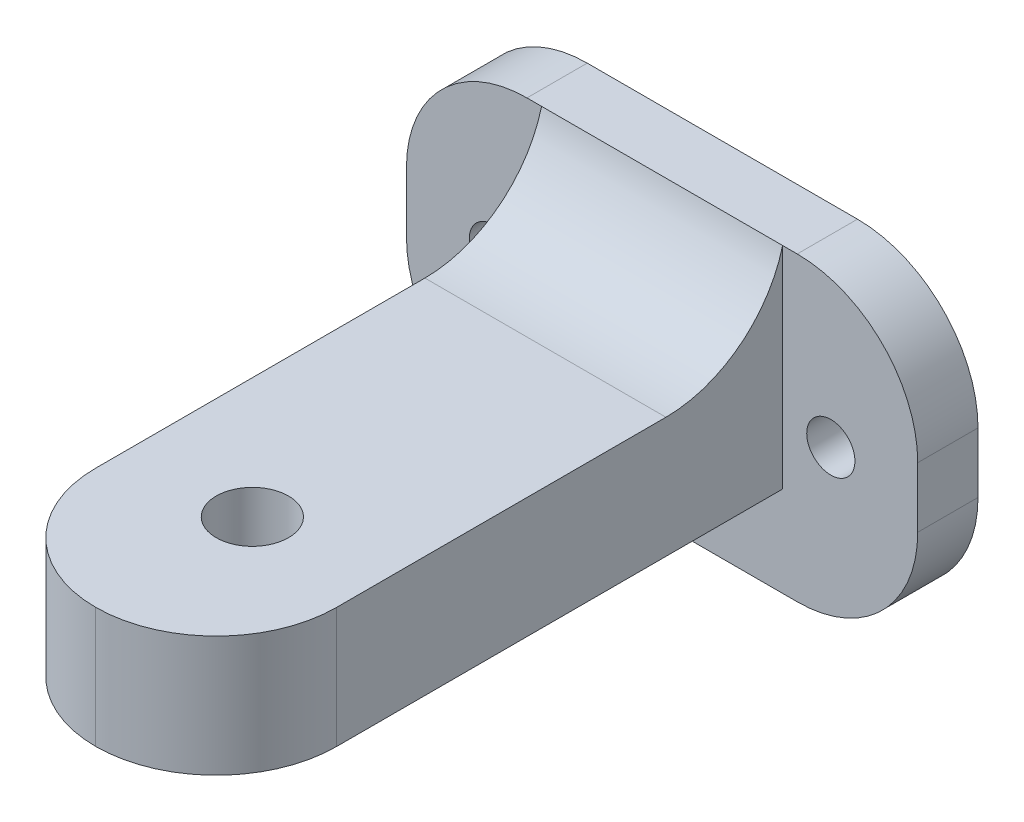
ISO-10303-21;
HEADER;
FILE_DESCRIPTION(('STEP AP214'),'2;1');
FILE_NAME('part.step','',(''),(''),'','','');
FILE_SCHEMA(('AUTOMOTIVE_DESIGN { 1 0 10303 214 1 1 1 1 }'));
ENDSEC;
DATA;
#1=APPLICATION_CONTEXT('core data for automotive mechanical design processes');
#2=APPLICATION_PROTOCOL_DEFINITION('international standard','automotive_design',2000,#1);
#3=PRODUCT_CONTEXT('',#1,'mechanical');
#4=PRODUCT('Part','Part','',(#3));
#5=PRODUCT_RELATED_PRODUCT_CATEGORY('part','',(#4));
#6=PRODUCT_DEFINITION_FORMATION('','',#4);
#7=PRODUCT_DEFINITION_CONTEXT('part definition',#1,'design');
#8=PRODUCT_DEFINITION('design','',#6,#7);
#9=PRODUCT_DEFINITION_SHAPE('','',#8);
#10=(LENGTH_UNIT() NAMED_UNIT(*) SI_UNIT(.MILLI.,.METRE.));
#11=(NAMED_UNIT(*) PLANE_ANGLE_UNIT() SI_UNIT($,.RADIAN.));
#12=(NAMED_UNIT(*) SI_UNIT($,.STERADIAN.) SOLID_ANGLE_UNIT());
#13=UNCERTAINTY_MEASURE_WITH_UNIT(LENGTH_MEASURE(1.E-05),#10,'distance_accuracy_value','');
#14=(GEOMETRIC_REPRESENTATION_CONTEXT(3) GLOBAL_UNCERTAINTY_ASSIGNED_CONTEXT((#13)) GLOBAL_UNIT_ASSIGNED_CONTEXT((#10,
#11,#12)) REPRESENTATION_CONTEXT('',''));
#15=CARTESIAN_POINT('',(0.,0.,0.));
#16=DIRECTION('',(0.,0.,1.));
#17=DIRECTION('',(1.,0.,0.));
#18=AXIS2_PLACEMENT_3D('',#15,#16,#17);
#19=CARTESIAN_POINT('',(0.,0.,5.));
#20=DIRECTION('',(0.,0.,1.));
#21=DIRECTION('',(1.,0.,0.));
#22=AXIS2_PLACEMENT_3D('',#19,#20,#21);
#23=PLANE('',#22);
#24=CARTESIAN_POINT('',(-14.,0.,5.));
#25=DIRECTION('',(0.,0.,1.));
#26=DIRECTION('',(1.,0.,0.));
#27=AXIS2_PLACEMENT_3D('',#24,#25,#26);
#28=CIRCLE('',#27,2.);
#29=CARTESIAN_POINT('',(-12.,0.,5.));
#30=VERTEX_POINT('',#29);
#31=EDGE_CURVE('E179',#30,#30,#28,.T.);
#32=ORIENTED_EDGE('',*,*,#31,.F.);
#33=EDGE_LOOP('',(#32));
#34=FACE_BOUND('',#33,.T.);
#35=DIRECTION('',(0.,-1.,0.));
#36=VECTOR('',#35,1.);
#37=CARTESIAN_POINT('',(-9.99999999999999,-5.,5.));
#38=LINE('',#37,#36);
#39=CARTESIAN_POINT('',(-9.99999999999999,12.5,5.));
#40=VERTEX_POINT('',#39);
#41=CARTESIAN_POINT('',(-9.99999999999999,-5.,5.));
#42=VERTEX_POINT('',#41);
#43=EDGE_CURVE('E153',#40,#42,#38,.T.);
#44=ORIENTED_EDGE('',*,*,#43,.F.);
#45=DIRECTION('',(-1.,0.,0.));
#46=VECTOR('',#45,1.);
#47=CARTESIAN_POINT('',(21.2127953618266,12.5,5.));
#48=LINE('',#47,#46);
#49=CARTESIAN_POINT('',(-11.2127953618266,12.5,5.));
#50=VERTEX_POINT('',#49);
#51=EDGE_CURVE('E195',#40,#50,#48,.T.);
#52=ORIENTED_EDGE('',*,*,#51,.T.);
#53=CARTESIAN_POINT('',(-11.2127953618266,2.5,5.));
#54=DIRECTION('',(0.,0.,1.));
#55=DIRECTION('',(1.,0.,0.));
#56=AXIS2_PLACEMENT_3D('',#53,#54,#55);
#57=CIRCLE('',#56,10.);
#58=CARTESIAN_POINT('',(-21.2127953618266,2.5,5.));
#59=VERTEX_POINT('',#58);
#60=EDGE_CURVE('E227',#50,#59,#57,.T.);
#61=ORIENTED_EDGE('',*,*,#60,.T.);
#62=DIRECTION('',(0.,-1.,0.));
#63=VECTOR('',#62,1.);
#64=CARTESIAN_POINT('',(-21.2127953618266,-12.5,5.));
#65=LINE('',#64,#63);
#66=CARTESIAN_POINT('',(-21.2127953618266,-2.5,5.));
#67=VERTEX_POINT('',#66);
#68=EDGE_CURVE('E185',#59,#67,#65,.T.);
#69=ORIENTED_EDGE('',*,*,#68,.T.);
#70=CARTESIAN_POINT('',(-11.2127953618266,-2.5,5.));
#71=DIRECTION('',(0.,0.,1.));
#72=DIRECTION('',(1.,0.,0.));
#73=AXIS2_PLACEMENT_3D('',#70,#71,#72);
#74=CIRCLE('',#73,10.);
#75=CARTESIAN_POINT('',(-11.2127953618266,-12.5,5.));
#76=VERTEX_POINT('',#75);
#77=EDGE_CURVE('E233',#67,#76,#74,.T.);
#78=ORIENTED_EDGE('',*,*,#77,.T.);
#79=DIRECTION('',(1.,0.,0.));
#80=VECTOR('',#79,1.);
#81=CARTESIAN_POINT('',(21.2127953618266,-12.5,5.));
#82=LINE('',#81,#80);
#83=CARTESIAN_POINT('',(11.2127953618266,-12.5,5.));
#84=VERTEX_POINT('',#83);
#85=EDGE_CURVE('E188',#76,#84,#82,.T.);
#86=ORIENTED_EDGE('',*,*,#85,.T.);
#87=CARTESIAN_POINT('',(11.2127953618266,-2.5,5.));
#88=DIRECTION('',(0.,0.,1.));
#89=DIRECTION('',(1.,0.,0.));
#90=AXIS2_PLACEMENT_3D('',#87,#88,#89);
#91=CIRCLE('',#90,10.);
#92=CARTESIAN_POINT('',(21.2127953618266,-2.5,5.));
#93=VERTEX_POINT('',#92);
#94=EDGE_CURVE('E231',#84,#93,#91,.T.);
#95=ORIENTED_EDGE('',*,*,#94,.T.);
#96=DIRECTION('',(0.,1.,0.));
#97=VECTOR('',#96,1.);
#98=CARTESIAN_POINT('',(21.2127953618266,-12.5,5.));
#99=LINE('',#98,#97);
#100=CARTESIAN_POINT('',(21.2127953618266,2.5,5.));
#101=VERTEX_POINT('',#100);
#102=EDGE_CURVE('E192',#93,#101,#99,.T.);
#103=ORIENTED_EDGE('',*,*,#102,.T.);
#104=CARTESIAN_POINT('',(11.2127953618266,2.5,5.));
#105=DIRECTION('',(0.,0.,1.));
#106=DIRECTION('',(1.,0.,0.));
#107=AXIS2_PLACEMENT_3D('',#104,#105,#106);
#108=CIRCLE('',#107,10.);
#109=CARTESIAN_POINT('',(11.2127953618266,12.5,5.));
#110=VERTEX_POINT('',#109);
#111=EDGE_CURVE('E229',#101,#110,#108,.T.);
#112=ORIENTED_EDGE('',*,*,#111,.T.);
#113=CARTESIAN_POINT('',(10.,12.5,5.));
#114=VERTEX_POINT('',#113);
#115=EDGE_CURVE('E196',#110,#114,#48,.T.);
#116=ORIENTED_EDGE('',*,*,#115,.T.);
#117=DIRECTION('',(0.,1.,0.));
#118=VECTOR('',#117,1.);
#119=CARTESIAN_POINT('',(10.,-5.,5.));
#120=LINE('',#119,#118);
#121=CARTESIAN_POINT('',(10.,-5.,5.));
#122=VERTEX_POINT('',#121);
#123=EDGE_CURVE('E162',#122,#114,#120,.T.);
#124=ORIENTED_EDGE('',*,*,#123,.F.);
#125=DIRECTION('',(1.,0.,0.));
#126=VECTOR('',#125,1.);
#127=CARTESIAN_POINT('',(10.,-5.,5.));
#128=LINE('',#127,#126);
#129=EDGE_CURVE('E144',#42,#122,#128,.T.);
#130=ORIENTED_EDGE('',*,*,#129,.F.);
#131=EDGE_LOOP('',(#44,#52,#61,#69,#78,#86,#95,#103,#112,#116,#124,#130));
#132=FACE_BOUND('',#131,.T.);
#133=CARTESIAN_POINT('',(14.,0.,5.));
#134=DIRECTION('',(0.,0.,1.));
#135=DIRECTION('',(-1.,0.,0.));
#136=AXIS2_PLACEMENT_3D('',#133,#134,#135);
#137=CIRCLE('',#136,2.);
#138=CARTESIAN_POINT('',(12.,0.,5.));
#139=VERTEX_POINT('',#138);
#140=EDGE_CURVE('E173',#139,#139,#137,.T.);
#141=ORIENTED_EDGE('',*,*,#140,.F.);
#142=EDGE_LOOP('',(#141));
#143=FACE_BOUND('',#142,.T.);
#144=ADVANCED_FACE('F41',(#34,#132,#143),#23,.T.);
#145=CARTESIAN_POINT('',(0.,0.,0.));
#146=DIRECTION('',(0.,0.,1.));
#147=DIRECTION('',(1.,0.,0.));
#148=AXIS2_PLACEMENT_3D('',#145,#146,#147);
#149=PLANE('',#148);
#150=DIRECTION('',(1.,0.,0.));
#151=VECTOR('',#150,1.);
#152=CARTESIAN_POINT('',(21.2127953618266,-12.5,0.));
#153=LINE('',#152,#151);
#154=CARTESIAN_POINT('',(-11.2127953618266,-12.5,0.));
#155=VERTEX_POINT('',#154);
#156=CARTESIAN_POINT('',(11.2127953618266,-12.5,0.));
#157=VERTEX_POINT('',#156);
#158=EDGE_CURVE('E202',#155,#157,#153,.T.);
#159=ORIENTED_EDGE('',*,*,#158,.F.);
#160=CARTESIAN_POINT('',(-11.2127953618266,-2.5,0.));
#161=DIRECTION('',(0.,0.,1.));
#162=DIRECTION('',(1.,0.,0.));
#163=AXIS2_PLACEMENT_3D('',#160,#161,#162);
#164=CIRCLE('',#163,10.);
#165=CARTESIAN_POINT('',(-21.2127953618266,-2.5,0.));
#166=VERTEX_POINT('',#165);
#167=EDGE_CURVE('E220',#155,#166,#164,.F.);
#168=ORIENTED_EDGE('',*,*,#167,.T.);
#169=DIRECTION('',(0.,-1.,0.));
#170=VECTOR('',#169,1.);
#171=CARTESIAN_POINT('',(-21.2127953618266,-12.5,0.));
#172=LINE('',#171,#170);
#173=CARTESIAN_POINT('',(-21.2127953618266,2.5,0.));
#174=VERTEX_POINT('',#173);
#175=EDGE_CURVE('E182',#174,#166,#172,.T.);
#176=ORIENTED_EDGE('',*,*,#175,.F.);
#177=CARTESIAN_POINT('',(-11.2127953618266,2.5,0.));
#178=DIRECTION('',(0.,0.,1.));
#179=DIRECTION('',(1.,0.,0.));
#180=AXIS2_PLACEMENT_3D('',#177,#178,#179);
#181=CIRCLE('',#180,10.);
#182=CARTESIAN_POINT('',(-11.2127953618266,12.5,0.));
#183=VERTEX_POINT('',#182);
#184=EDGE_CURVE('E214',#174,#183,#181,.F.);
#185=ORIENTED_EDGE('',*,*,#184,.T.);
#186=DIRECTION('',(-1.,0.,0.));
#187=VECTOR('',#186,1.);
#188=CARTESIAN_POINT('',(21.2127953618266,12.5,0.));
#189=LINE('',#188,#187);
#190=CARTESIAN_POINT('',(11.2127953618266,12.5,0.));
#191=VERTEX_POINT('',#190);
#192=EDGE_CURVE('E189',#191,#183,#189,.T.);
#193=ORIENTED_EDGE('',*,*,#192,.F.);
#194=CARTESIAN_POINT('',(11.2127953618266,2.5,0.));
#195=DIRECTION('',(0.,0.,1.));
#196=DIRECTION('',(1.,0.,0.));
#197=AXIS2_PLACEMENT_3D('',#194,#195,#196);
#198=CIRCLE('',#197,10.);
#199=CARTESIAN_POINT('',(21.2127953618266,2.5,0.));
#200=VERTEX_POINT('',#199);
#201=EDGE_CURVE('E216',#191,#200,#198,.F.);
#202=ORIENTED_EDGE('',*,*,#201,.T.);
#203=DIRECTION('',(0.,1.,0.));
#204=VECTOR('',#203,1.);
#205=CARTESIAN_POINT('',(21.2127953618266,-12.5,0.));
#206=LINE('',#205,#204);
#207=CARTESIAN_POINT('',(21.2127953618266,-2.5,0.));
#208=VERTEX_POINT('',#207);
#209=EDGE_CURVE('E205',#208,#200,#206,.T.);
#210=ORIENTED_EDGE('',*,*,#209,.F.);
#211=CARTESIAN_POINT('',(11.2127953618266,-2.5,0.));
#212=DIRECTION('',(0.,0.,1.));
#213=DIRECTION('',(1.,0.,0.));
#214=AXIS2_PLACEMENT_3D('',#211,#212,#213);
#215=CIRCLE('',#214,10.);
#216=EDGE_CURVE('E218',#208,#157,#215,.F.);
#217=ORIENTED_EDGE('',*,*,#216,.T.);
#218=EDGE_LOOP('',(#159,#168,#176,#185,#193,#202,#210,#217));
#219=FACE_BOUND('',#218,.T.);
#220=CARTESIAN_POINT('',(-14.,0.,0.));
#221=DIRECTION('',(0.,0.,1.));
#222=DIRECTION('',(1.,0.,0.));
#223=AXIS2_PLACEMENT_3D('',#220,#221,#222);
#224=CIRCLE('',#223,2.);
#225=CARTESIAN_POINT('',(-12.,0.,0.));
#226=VERTEX_POINT('',#225);
#227=EDGE_CURVE('E176',#226,#226,#224,.T.);
#228=ORIENTED_EDGE('',*,*,#227,.T.);
#229=EDGE_LOOP('',(#228));
#230=FACE_BOUND('',#229,.T.);
#231=CARTESIAN_POINT('',(14.,0.,0.));
#232=DIRECTION('',(0.,0.,1.));
#233=DIRECTION('',(-1.,0.,0.));
#234=AXIS2_PLACEMENT_3D('',#231,#232,#233);
#235=CIRCLE('',#234,2.);
#236=CARTESIAN_POINT('',(12.,0.,0.));
#237=VERTEX_POINT('',#236);
#238=EDGE_CURVE('E149',#237,#237,#235,.T.);
#239=ORIENTED_EDGE('',*,*,#238,.T.);
#240=EDGE_LOOP('',(#239));
#241=FACE_BOUND('',#240,.T.);
#242=ADVANCED_FACE('F294',(#219,#230,#241),#149,.F.);
#243=CARTESIAN_POINT('',(-21.2127953618266,-12.5,5.));
#244=DIRECTION('',(1.,0.,0.));
#245=DIRECTION('',(0.,0.,-1.));
#246=AXIS2_PLACEMENT_3D('',#243,#244,#245);
#247=PLANE('',#246);
#248=ORIENTED_EDGE('',*,*,#175,.T.);
#249=DIRECTION('',(0.,0.,-1.));
#250=VECTOR('',#249,1.);
#251=CARTESIAN_POINT('',(-21.2127953618266,-2.5,5.));
#252=LINE('',#251,#250);
#253=EDGE_CURVE('E225',#166,#67,#252,.F.);
#254=ORIENTED_EDGE('',*,*,#253,.T.);
#255=ORIENTED_EDGE('',*,*,#68,.F.);
#256=DIRECTION('',(0.,0.,-1.));
#257=VECTOR('',#256,1.);
#258=CARTESIAN_POINT('',(-21.2127953618266,2.5,5.));
#259=LINE('',#258,#257);
#260=EDGE_CURVE('E222',#59,#174,#259,.T.);
#261=ORIENTED_EDGE('',*,*,#260,.T.);
#262=EDGE_LOOP('',(#248,#254,#255,#261));
#263=FACE_BOUND('',#262,.T.);
#264=ADVANCED_FACE('F290',(#263),#247,.F.);
#265=CARTESIAN_POINT('',(21.2127953618266,-12.5,5.));
#266=DIRECTION('',(0.,1.,0.));
#267=DIRECTION('',(-1.,0.,0.));
#268=AXIS2_PLACEMENT_3D('',#265,#266,#267);
#269=PLANE('',#268);
#270=ORIENTED_EDGE('',*,*,#85,.F.);
#271=DIRECTION('',(0.,0.,-1.));
#272=VECTOR('',#271,1.);
#273=CARTESIAN_POINT('',(-11.2127953618266,-12.5,5.));
#274=LINE('',#273,#272);
#275=EDGE_CURVE('E211',#76,#155,#274,.T.);
#276=ORIENTED_EDGE('',*,*,#275,.T.);
#277=ORIENTED_EDGE('',*,*,#158,.T.);
#278=DIRECTION('',(0.,0.,-1.));
#279=VECTOR('',#278,1.);
#280=CARTESIAN_POINT('',(11.2127953618266,-12.5,5.));
#281=LINE('',#280,#279);
#282=EDGE_CURVE('E198',#157,#84,#281,.F.);
#283=ORIENTED_EDGE('',*,*,#282,.T.);
#284=EDGE_LOOP('',(#270,#276,#277,#283));
#285=FACE_BOUND('',#284,.T.);
#286=ADVANCED_FACE('F302',(#285),#269,.F.);
#287=CARTESIAN_POINT('',(21.2127953618266,-12.5,5.));
#288=DIRECTION('',(-1.,0.,0.));
#289=DIRECTION('',(0.,0.,1.));
#290=AXIS2_PLACEMENT_3D('',#287,#288,#289);
#291=PLANE('',#290);
#292=ORIENTED_EDGE('',*,*,#102,.F.);
#293=DIRECTION('',(0.,0.,-1.));
#294=VECTOR('',#293,1.);
#295=CARTESIAN_POINT('',(21.2127953618266,-2.5,5.));
#296=LINE('',#295,#294);
#297=EDGE_CURVE('E237',#93,#208,#296,.T.);
#298=ORIENTED_EDGE('',*,*,#297,.T.);
#299=ORIENTED_EDGE('',*,*,#209,.T.);
#300=DIRECTION('',(0.,0.,-1.));
#301=VECTOR('',#300,1.);
#302=CARTESIAN_POINT('',(21.2127953618266,2.5,5.));
#303=LINE('',#302,#301);
#304=EDGE_CURVE('E235',#200,#101,#303,.F.);
#305=ORIENTED_EDGE('',*,*,#304,.T.);
#306=EDGE_LOOP('',(#292,#298,#299,#305));
#307=FACE_BOUND('',#306,.T.);
#308=ADVANCED_FACE('F311',(#307),#291,.F.);
#309=CARTESIAN_POINT('',(21.2127953618266,12.5,5.));
#310=DIRECTION('',(0.,-1.,0.));
#311=DIRECTION('',(1.,0.,0.));
#312=AXIS2_PLACEMENT_3D('',#309,#310,#311);
#313=PLANE('',#312);
#314=ORIENTED_EDGE('',*,*,#115,.F.);
#315=DIRECTION('',(0.,0.,-1.));
#316=VECTOR('',#315,1.);
#317=CARTESIAN_POINT('',(11.2127953618266,12.5,5.));
#318=LINE('',#317,#316);
#319=EDGE_CURVE('E243',#110,#191,#318,.T.);
#320=ORIENTED_EDGE('',*,*,#319,.T.);
#321=ORIENTED_EDGE('',*,*,#192,.T.);
#322=DIRECTION('',(0.,0.,-1.));
#323=VECTOR('',#322,1.);
#324=CARTESIAN_POINT('',(-11.2127953618266,12.5,5.));
#325=LINE('',#324,#323);
#326=EDGE_CURVE('E240',#183,#50,#325,.F.);
#327=ORIENTED_EDGE('',*,*,#326,.T.);
#328=ORIENTED_EDGE('',*,*,#51,.F.);
#329=EDGE_CURVE('E199',#114,#40,#48,.T.);
#330=ORIENTED_EDGE('',*,*,#329,.F.);
#331=EDGE_LOOP('',(#314,#320,#321,#327,#328,#330));
#332=FACE_BOUND('',#331,.T.);
#333=ADVANCED_FACE('F283',(#332),#313,.F.);
#334=CARTESIAN_POINT('',(-14.,0.,5.));
#335=DIRECTION('',(0.,0.,-1.));
#336=DIRECTION('',(-1.,0.,0.));
#337=AXIS2_PLACEMENT_3D('',#334,#335,#336);
#338=CYLINDRICAL_SURFACE('',#337,2.);
#339=ORIENTED_EDGE('',*,*,#31,.T.);
#340=EDGE_LOOP('',(#339));
#341=FACE_BOUND('',#340,.T.);
#342=ORIENTED_EDGE('',*,*,#227,.F.);
#343=EDGE_LOOP('',(#342));
#344=FACE_BOUND('',#343,.T.);
#345=ADVANCED_FACE('F336',(#341,#344),#338,.F.);
#346=CARTESIAN_POINT('',(14.,0.,5.));
#347=DIRECTION('',(0.,0.,-1.));
#348=DIRECTION('',(-1.,0.,0.));
#349=AXIS2_PLACEMENT_3D('',#346,#347,#348);
#350=CYLINDRICAL_SURFACE('',#349,2.);
#351=ORIENTED_EDGE('',*,*,#140,.T.);
#352=EDGE_LOOP('',(#351));
#353=FACE_BOUND('',#352,.T.);
#354=ORIENTED_EDGE('',*,*,#238,.F.);
#355=EDGE_LOOP('',(#354));
#356=FACE_BOUND('',#355,.T.);
#357=ADVANCED_FACE('F347',(#353,#356),#350,.F.);
#358=CARTESIAN_POINT('',(-11.2127953618266,-2.5,5.));
#359=DIRECTION('',(0.,0.,-1.));
#360=DIRECTION('',(-1.,0.,0.));
#361=AXIS2_PLACEMENT_3D('',#358,#359,#360);
#362=CYLINDRICAL_SURFACE('',#361,10.);
#363=ORIENTED_EDGE('',*,*,#77,.F.);
#364=ORIENTED_EDGE('',*,*,#253,.F.);
#365=ORIENTED_EDGE('',*,*,#167,.F.);
#366=ORIENTED_EDGE('',*,*,#275,.F.);
#367=EDGE_LOOP('',(#363,#364,#365,#366));
#368=FACE_BOUND('',#367,.T.);
#369=ADVANCED_FACE('F299',(#368),#362,.T.);
#370=CARTESIAN_POINT('',(11.2127953618266,-2.5,5.));
#371=DIRECTION('',(0.,0.,-1.));
#372=DIRECTION('',(-1.,0.,0.));
#373=AXIS2_PLACEMENT_3D('',#370,#371,#372);
#374=CYLINDRICAL_SURFACE('',#373,10.);
#375=ORIENTED_EDGE('',*,*,#94,.F.);
#376=ORIENTED_EDGE('',*,*,#282,.F.);
#377=ORIENTED_EDGE('',*,*,#216,.F.);
#378=ORIENTED_EDGE('',*,*,#297,.F.);
#379=EDGE_LOOP('',(#375,#376,#377,#378));
#380=FACE_BOUND('',#379,.T.);
#381=ADVANCED_FACE('F308',(#380),#374,.T.);
#382=CARTESIAN_POINT('',(11.2127953618266,2.5,5.));
#383=DIRECTION('',(0.,0.,-1.));
#384=DIRECTION('',(-1.,0.,0.));
#385=AXIS2_PLACEMENT_3D('',#382,#383,#384);
#386=CYLINDRICAL_SURFACE('',#385,10.);
#387=ORIENTED_EDGE('',*,*,#111,.F.);
#388=ORIENTED_EDGE('',*,*,#304,.F.);
#389=ORIENTED_EDGE('',*,*,#201,.F.);
#390=ORIENTED_EDGE('',*,*,#319,.F.);
#391=EDGE_LOOP('',(#387,#388,#389,#390));
#392=FACE_BOUND('',#391,.T.);
#393=ADVANCED_FACE('F316',(#392),#386,.T.);
#394=CARTESIAN_POINT('',(-11.2127953618266,2.5,5.));
#395=DIRECTION('',(0.,0.,-1.));
#396=DIRECTION('',(-1.,0.,0.));
#397=AXIS2_PLACEMENT_3D('',#394,#395,#396);
#398=CYLINDRICAL_SURFACE('',#397,10.);
#399=ORIENTED_EDGE('',*,*,#60,.F.);
#400=ORIENTED_EDGE('',*,*,#326,.F.);
#401=ORIENTED_EDGE('',*,*,#184,.F.);
#402=ORIENTED_EDGE('',*,*,#260,.F.);
#403=EDGE_LOOP('',(#399,#400,#401,#402));
#404=FACE_BOUND('',#403,.T.);
#405=ADVANCED_FACE('F287',(#404),#398,.T.);
#406=CARTESIAN_POINT('',(-9.99999999999999,-5.,52.));
#407=DIRECTION('',(1.,0.,0.));
#408=DIRECTION('',(0.,0.,-1.));
#409=AXIS2_PLACEMENT_3D('',#406,#407,#408);
#410=PLANE('',#409);
#411=DIRECTION('',(0.,0.,-1.));
#412=VECTOR('',#411,1.);
#413=CARTESIAN_POINT('',(-9.99999999999999,-5.,52.));
#414=LINE('',#413,#412);
#415=CARTESIAN_POINT('',(-9.99999999999999,-5.,42.));
#416=VERTEX_POINT('',#415);
#417=EDGE_CURVE('E140',#416,#42,#414,.T.);
#418=ORIENTED_EDGE('',*,*,#417,.F.);
#419=DIRECTION('',(0.,-1.,0.));
#420=VECTOR('',#419,1.);
#421=CARTESIAN_POINT('',(-9.99999999999999,5.,42.));
#422=LINE('',#421,#420);
#423=CARTESIAN_POINT('',(-9.99999999999999,5.,42.));
#424=VERTEX_POINT('',#423);
#425=EDGE_CURVE('E255',#416,#424,#422,.F.);
#426=ORIENTED_EDGE('',*,*,#425,.T.);
#427=DIRECTION('',(0.,0.,-1.));
#428=VECTOR('',#427,1.);
#429=CARTESIAN_POINT('',(-9.99999999999999,5.,52.));
#430=LINE('',#429,#428);
#431=CARTESIAN_POINT('',(-9.99999999999999,5.,14.6824583655185));
#432=VERTEX_POINT('',#431);
#433=EDGE_CURVE('E164',#424,#432,#430,.T.);
#434=ORIENTED_EDGE('',*,*,#433,.T.);
#435=CARTESIAN_POINT('',(-9.99999999999999,15.,14.6824583655185));
#436=DIRECTION('',(1.,0.,0.));
#437=DIRECTION('',(0.,0.,-1.));
#438=AXIS2_PLACEMENT_3D('',#435,#436,#437);
#439=CIRCLE('',#438,10.);
#440=EDGE_CURVE('E50',#432,#40,#439,.T.);
#441=ORIENTED_EDGE('',*,*,#440,.T.);
#442=ORIENTED_EDGE('',*,*,#43,.T.);
#443=EDGE_LOOP('',(#418,#426,#434,#441,#442));
#444=FACE_BOUND('',#443,.T.);
#445=ADVANCED_FACE('F154',(#444),#410,.F.);
#446=CARTESIAN_POINT('',(10.,-5.,52.));
#447=DIRECTION('',(0.,1.,0.));
#448=DIRECTION('',(-1.,0.,0.));
#449=AXIS2_PLACEMENT_3D('',#446,#447,#448);
#450=PLANE('',#449);
#451=CARTESIAN_POINT('',(0.,-5.,39.));
#452=DIRECTION('',(0.,-1.,0.));
#453=DIRECTION('',(1.,0.,0.));
#454=AXIS2_PLACEMENT_3D('',#451,#452,#453);
#455=CIRCLE('',#454,5.25);
#456=CARTESIAN_POINT('',(5.25,-5.,39.));
#457=VERTEX_POINT('',#456);
#458=EDGE_CURVE('E389',#457,#457,#455,.T.);
#459=ORIENTED_EDGE('',*,*,#458,.F.);
#460=EDGE_LOOP('',(#459));
#461=FACE_BOUND('',#460,.T.);
#462=CARTESIAN_POINT('',(0.,-5.,42.));
#463=DIRECTION('',(0.,1.,0.));
#464=DIRECTION('',(-1.,0.,0.));
#465=AXIS2_PLACEMENT_3D('',#462,#463,#464);
#466=CIRCLE('',#465,10.);
#467=CARTESIAN_POINT('',(10.,-5.,42.));
#468=VERTEX_POINT('',#467);
#469=CARTESIAN_POINT('',(0.,-5.,52.));
#470=VERTEX_POINT('',#469);
#471=EDGE_CURVE('E62',#468,#470,#466,.F.);
#472=ORIENTED_EDGE('',*,*,#471,.T.);
#473=CARTESIAN_POINT('',(0.,-5.,42.));
#474=DIRECTION('',(0.,1.,0.));
#475=DIRECTION('',(-1.,0.,0.));
#476=AXIS2_PLACEMENT_3D('',#473,#474,#475);
#477=CIRCLE('',#476,10.);
#478=EDGE_CURVE('E57',#470,#416,#477,.F.);
#479=ORIENTED_EDGE('',*,*,#478,.T.);
#480=ORIENTED_EDGE('',*,*,#417,.T.);
#481=ORIENTED_EDGE('',*,*,#129,.T.);
#482=DIRECTION('',(0.,0.,-1.));
#483=VECTOR('',#482,1.);
#484=CARTESIAN_POINT('',(10.,-5.,52.));
#485=LINE('',#484,#483);
#486=EDGE_CURVE('E150',#468,#122,#485,.T.);
#487=ORIENTED_EDGE('',*,*,#486,.F.);
#488=EDGE_LOOP('',(#472,#479,#480,#481,#487));
#489=FACE_BOUND('',#488,.T.);
#490=ADVANCED_FACE('F142',(#461,#489),#450,.F.);
#491=CARTESIAN_POINT('',(10.,-5.,52.));
#492=DIRECTION('',(-1.,0.,0.));
#493=DIRECTION('',(0.,0.,1.));
#494=AXIS2_PLACEMENT_3D('',#491,#492,#493);
#495=PLANE('',#494);
#496=DIRECTION('',(0.,0.,-1.));
#497=VECTOR('',#496,1.);
#498=CARTESIAN_POINT('',(10.,5.,52.));
#499=LINE('',#498,#497);
#500=CARTESIAN_POINT('',(10.,5.,42.));
#501=VERTEX_POINT('',#500);
#502=CARTESIAN_POINT('',(10.,5.,14.6824583655185));
#503=VERTEX_POINT('',#502);
#504=EDGE_CURVE('E169',#501,#503,#499,.T.);
#505=ORIENTED_EDGE('',*,*,#504,.F.);
#506=DIRECTION('',(0.,1.,0.));
#507=VECTOR('',#506,1.);
#508=CARTESIAN_POINT('',(10.,-5.,42.));
#509=LINE('',#508,#507);
#510=EDGE_CURVE('E257',#501,#468,#509,.F.);
#511=ORIENTED_EDGE('',*,*,#510,.T.);
#512=ORIENTED_EDGE('',*,*,#486,.T.);
#513=ORIENTED_EDGE('',*,*,#123,.T.);
#514=CARTESIAN_POINT('',(10.,15.,14.6824583655185));
#515=DIRECTION('',(-1.,0.,0.));
#516=DIRECTION('',(0.,0.,1.));
#517=AXIS2_PLACEMENT_3D('',#514,#515,#516);
#518=CIRCLE('',#517,10.);
#519=EDGE_CURVE('E11',#114,#503,#518,.T.);
#520=ORIENTED_EDGE('',*,*,#519,.T.);
#521=EDGE_LOOP('',(#505,#511,#512,#513,#520));
#522=FACE_BOUND('',#521,.T.);
#523=ADVANCED_FACE('F262',(#522),#495,.F.);
#524=CARTESIAN_POINT('',(10.,5.,52.));
#525=DIRECTION('',(0.,-1.,0.));
#526=DIRECTION('',(1.,0.,0.));
#527=AXIS2_PLACEMENT_3D('',#524,#525,#526);
#528=PLANE('',#527);
#529=CARTESIAN_POINT('',(0.,5.,39.));
#530=DIRECTION('',(0.,-1.,0.));
#531=DIRECTION('',(1.,0.,0.));
#532=AXIS2_PLACEMENT_3D('',#529,#530,#531);
#533=CIRCLE('',#532,3.);
#534=CARTESIAN_POINT('',(3.,5.,39.));
#535=VERTEX_POINT('',#534);
#536=EDGE_CURVE('E385',#535,#535,#533,.T.);
#537=ORIENTED_EDGE('',*,*,#536,.T.);
#538=EDGE_LOOP('',(#537));
#539=FACE_BOUND('',#538,.T.);
#540=ORIENTED_EDGE('',*,*,#504,.T.);
#541=DIRECTION('',(1.,0.,0.));
#542=VECTOR('',#541,1.);
#543=CARTESIAN_POINT('',(10.,5.,14.6824583655185));
#544=LINE('',#543,#542);
#545=EDGE_CURVE('E250',#503,#432,#544,.F.);
#546=ORIENTED_EDGE('',*,*,#545,.T.);
#547=ORIENTED_EDGE('',*,*,#433,.F.);
#548=CARTESIAN_POINT('',(0.,5.,42.));
#549=DIRECTION('',(0.,-1.,0.));
#550=DIRECTION('',(1.,0.,0.));
#551=AXIS2_PLACEMENT_3D('',#548,#549,#550);
#552=CIRCLE('',#551,10.);
#553=CARTESIAN_POINT('',(0.,5.,52.));
#554=VERTEX_POINT('',#553);
#555=EDGE_CURVE('E248',#424,#554,#552,.F.);
#556=ORIENTED_EDGE('',*,*,#555,.T.);
#557=CARTESIAN_POINT('',(0.,5.,42.));
#558=DIRECTION('',(0.,-1.,0.));
#559=DIRECTION('',(1.,0.,0.));
#560=AXIS2_PLACEMENT_3D('',#557,#558,#559);
#561=CIRCLE('',#560,10.);
#562=EDGE_CURVE('E246',#554,#501,#561,.F.);
#563=ORIENTED_EDGE('',*,*,#562,.T.);
#564=EDGE_LOOP('',(#540,#546,#547,#556,#563));
#565=FACE_BOUND('',#564,.T.);
#566=ADVANCED_FACE('F271',(#539,#565),#528,.F.);
#567=CARTESIAN_POINT('',(0.,0.,39.));
#568=DIRECTION('',(0.,-1.,0.));
#569=DIRECTION('',(1.,0.,0.));
#570=AXIS2_PLACEMENT_3D('',#567,#568,#569);
#571=CYLINDRICAL_SURFACE('',#570,5.25);
#572=CARTESIAN_POINT('',(0.,0.,39.));
#573=DIRECTION('',(0.,-1.,0.));
#574=DIRECTION('',(1.,0.,0.));
#575=AXIS2_PLACEMENT_3D('',#572,#573,#574);
#576=CIRCLE('',#575,5.25);
#577=CARTESIAN_POINT('',(5.25,0.,39.));
#578=VERTEX_POINT('',#577);
#579=EDGE_CURVE('E158',#578,#578,#576,.T.);
#580=ORIENTED_EDGE('',*,*,#579,.F.);
#581=EDGE_LOOP('',(#580));
#582=FACE_BOUND('',#581,.T.);
#583=ORIENTED_EDGE('',*,*,#458,.T.);
#584=EDGE_LOOP('',(#583));
#585=FACE_BOUND('',#584,.T.);
#586=ADVANCED_FACE('F367',(#582,#585),#571,.F.);
#587=CARTESIAN_POINT('',(0.,0.,39.));
#588=DIRECTION('',(0.,-1.,0.));
#589=DIRECTION('',(1.,0.,0.));
#590=AXIS2_PLACEMENT_3D('',#587,#588,#589);
#591=PLANE('',#590);
#592=CARTESIAN_POINT('',(0.,0.,39.));
#593=DIRECTION('',(0.,-1.,0.));
#594=DIRECTION('',(1.,0.,0.));
#595=AXIS2_PLACEMENT_3D('',#592,#593,#594);
#596=CIRCLE('',#595,3.);
#597=CARTESIAN_POINT('',(3.,0.,39.));
#598=VERTEX_POINT('',#597);
#599=EDGE_CURVE('E267',#598,#598,#596,.T.);
#600=ORIENTED_EDGE('',*,*,#599,.F.);
#601=EDGE_LOOP('',(#600));
#602=FACE_BOUND('',#601,.T.);
#603=ORIENTED_EDGE('',*,*,#579,.T.);
#604=EDGE_LOOP('',(#603));
#605=FACE_BOUND('',#604,.T.);
#606=ADVANCED_FACE('F371',(#602,#605),#591,.T.);
#607=CARTESIAN_POINT('',(0.,5.,39.));
#608=DIRECTION('',(0.,-1.,0.));
#609=DIRECTION('',(1.,0.,0.));
#610=AXIS2_PLACEMENT_3D('',#607,#608,#609);
#611=CYLINDRICAL_SURFACE('',#610,3.);
#612=ORIENTED_EDGE('',*,*,#536,.F.);
#613=EDGE_LOOP('',(#612));
#614=FACE_BOUND('',#613,.T.);
#615=ORIENTED_EDGE('',*,*,#599,.T.);
#616=EDGE_LOOP('',(#615));
#617=FACE_BOUND('',#616,.T.);
#618=ADVANCED_FACE('F375',(#614,#617),#611,.F.);
#619=CARTESIAN_POINT('',(0.,15.,14.6824583655185));
#620=DIRECTION('',(1.,0.,0.));
#621=DIRECTION('',(0.,1.,0.));
#622=AXIS2_PLACEMENT_3D('',#619,#620,#621);
#623=CYLINDRICAL_SURFACE('',#622,10.);
#624=ORIENTED_EDGE('',*,*,#519,.F.);
#625=ORIENTED_EDGE('',*,*,#329,.T.);
#626=ORIENTED_EDGE('',*,*,#440,.F.);
#627=ORIENTED_EDGE('',*,*,#545,.F.);
#628=EDGE_LOOP('',(#624,#625,#626,#627));
#629=FACE_BOUND('',#628,.T.);
#630=ADVANCED_FACE('F275',(#629),#623,.F.);
#631=CARTESIAN_POINT('',(0.,0.,42.));
#632=DIRECTION('',(0.,-1.,0.));
#633=DIRECTION('',(0.,0.,-1.));
#634=AXIS2_PLACEMENT_3D('',#631,#632,#633);
#635=CYLINDRICAL_SURFACE('',#634,10.);
#636=ORIENTED_EDGE('',*,*,#510,.F.);
#637=ORIENTED_EDGE('',*,*,#562,.F.);
#638=DIRECTION('',(0.,1.,0.));
#639=VECTOR('',#638,1.);
#640=CARTESIAN_POINT('',(0.,5.,52.));
#641=LINE('',#640,#639);
#642=EDGE_CURVE('E45',#470,#554,#641,.T.);
#643=ORIENTED_EDGE('',*,*,#642,.F.);
#644=ORIENTED_EDGE('',*,*,#471,.F.);
#645=EDGE_LOOP('',(#636,#637,#643,#644));
#646=FACE_BOUND('',#645,.T.);
#647=ADVANCED_FACE('F43',(#646),#635,.T.);
#648=CARTESIAN_POINT('',(0.,0.,42.));
#649=DIRECTION('',(0.,1.,0.));
#650=DIRECTION('',(0.,0.,1.));
#651=AXIS2_PLACEMENT_3D('',#648,#649,#650);
#652=CYLINDRICAL_SURFACE('',#651,10.);
#653=ORIENTED_EDGE('',*,*,#555,.F.);
#654=ORIENTED_EDGE('',*,*,#425,.F.);
#655=ORIENTED_EDGE('',*,*,#478,.F.);
#656=ORIENTED_EDGE('',*,*,#642,.T.);
#657=EDGE_LOOP('',(#653,#654,#655,#656));
#658=FACE_BOUND('',#657,.T.);
#659=ADVANCED_FACE('F268',(#658),#652,.T.);
#660=CLOSED_SHELL('',(#144,#242,#264,#286,#308,#333,#345,#357,#369,#381,#393,#405,#445,#490,
#523,#566,#586,#606,#618,#630,#647,#659));
#661=MANIFOLD_SOLID_BREP('B2',#660);
#662=ADVANCED_BREP_SHAPE_REPRESENTATION('',(#18,#661),#14);
#663=SHAPE_DEFINITION_REPRESENTATION(#9,#662);
ENDSEC;
END-ISO-10303-21;
